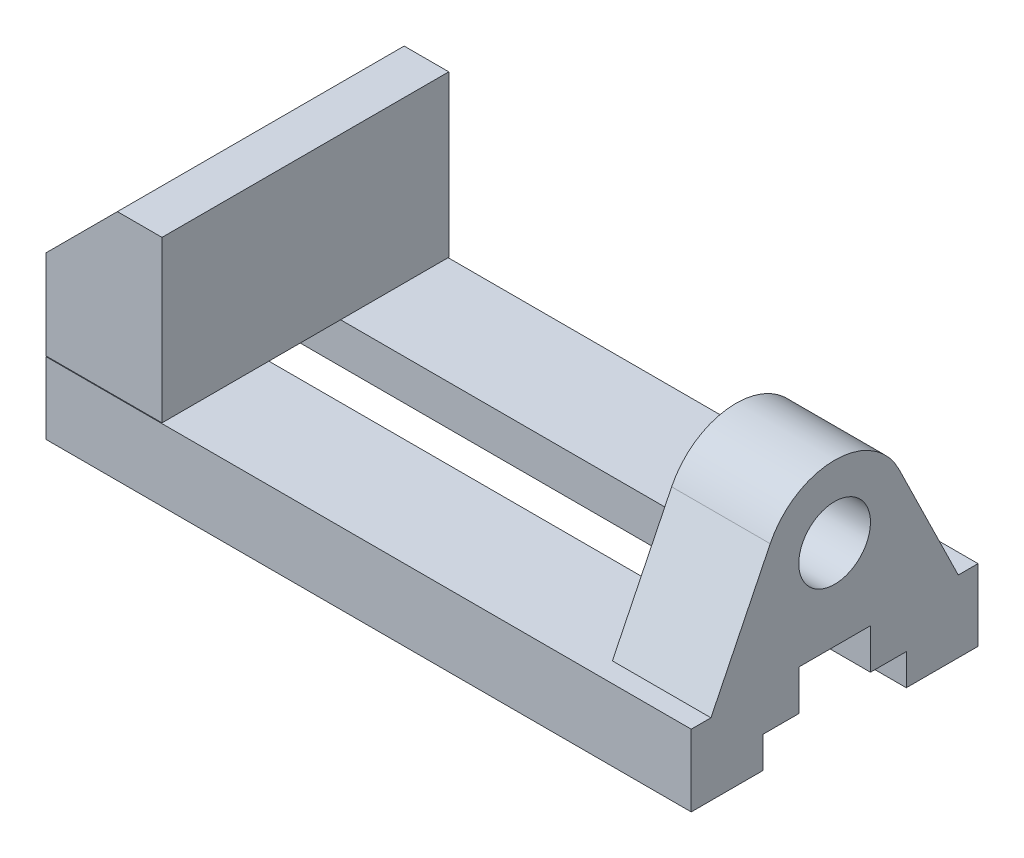
ISO-10303-21;
HEADER;
FILE_DESCRIPTION(('STEP AP214'),'2;1');
FILE_NAME('part.step','',(''),(''),'','','');
FILE_SCHEMA(('AUTOMOTIVE_DESIGN { 1 0 10303 214 1 1 1 1 }'));
ENDSEC;
DATA;
#1=APPLICATION_CONTEXT('core data for automotive mechanical design processes');
#2=APPLICATION_PROTOCOL_DEFINITION('international standard','automotive_design',2000,#1);
#3=PRODUCT_CONTEXT('',#1,'mechanical');
#4=PRODUCT('Part','Part','',(#3));
#5=PRODUCT_RELATED_PRODUCT_CATEGORY('part','',(#4));
#6=PRODUCT_DEFINITION_FORMATION('','',#4);
#7=PRODUCT_DEFINITION_CONTEXT('part definition',#1,'design');
#8=PRODUCT_DEFINITION('design','',#6,#7);
#9=PRODUCT_DEFINITION_SHAPE('','',#8);
#10=(LENGTH_UNIT() NAMED_UNIT(*) SI_UNIT(.MILLI.,.METRE.));
#11=(NAMED_UNIT(*) PLANE_ANGLE_UNIT() SI_UNIT($,.RADIAN.));
#12=(NAMED_UNIT(*) SI_UNIT($,.STERADIAN.) SOLID_ANGLE_UNIT());
#13=UNCERTAINTY_MEASURE_WITH_UNIT(LENGTH_MEASURE(1.E-05),#10,'distance_accuracy_value','');
#14=(GEOMETRIC_REPRESENTATION_CONTEXT(3) GLOBAL_UNCERTAINTY_ASSIGNED_CONTEXT((#13)) GLOBAL_UNIT_ASSIGNED_CONTEXT((#10,
#11,#12)) REPRESENTATION_CONTEXT('',''));
#15=CARTESIAN_POINT('',(0.,0.,0.));
#16=DIRECTION('',(0.,0.,1.));
#17=DIRECTION('',(1.,0.,0.));
#18=AXIS2_PLACEMENT_3D('',#15,#16,#17);
#19=CARTESIAN_POINT('',(-72.,8.15004747972741,-32.));
#20=DIRECTION('',(-1.,0.,0.));
#21=DIRECTION('',(0.,0.,1.));
#22=AXIS2_PLACEMENT_3D('',#19,#20,#21);
#23=PLANE('',#22);
#24=DIRECTION('',(0.,-1.,0.));
#25=VECTOR('',#24,1.);
#26=CARTESIAN_POINT('',(-72.,8.15004747972741,32.));
#27=LINE('',#26,#25);
#28=CARTESIAN_POINT('',(-72.,28.0666877687677,32.));
#29=VERTEX_POINT('',#28);
#30=CARTESIAN_POINT('',(-72.,8.15004747972741,32.));
#31=VERTEX_POINT('',#30);
#32=EDGE_CURVE('E128',#29,#31,#27,.T.);
#33=ORIENTED_EDGE('',*,*,#32,.F.);
#34=DIRECTION('',(0.,0.,1.));
#35=VECTOR('',#34,1.);
#36=CARTESIAN_POINT('',(-72.,28.0666877687677,-32.));
#37=LINE('',#36,#35);
#38=CARTESIAN_POINT('',(-72.,28.0666877687677,-32.));
#39=VERTEX_POINT('',#38);
#40=EDGE_CURVE('E12',#39,#29,#37,.T.);
#41=ORIENTED_EDGE('',*,*,#40,.F.);
#42=DIRECTION('',(0.,-1.,0.));
#43=VECTOR('',#42,1.);
#44=CARTESIAN_POINT('',(-72.,8.15004747972741,-32.));
#45=LINE('',#44,#43);
#46=CARTESIAN_POINT('',(-72.,8.15004747972741,-32.));
#47=VERTEX_POINT('',#46);
#48=EDGE_CURVE('E123',#39,#47,#45,.T.);
#49=ORIENTED_EDGE('',*,*,#48,.T.);
#50=DIRECTION('',(0.,0.,1.));
#51=VECTOR('',#50,1.);
#52=CARTESIAN_POINT('',(-72.,8.15004747972741,-32.));
#53=LINE('',#52,#51);
#54=EDGE_CURVE('E54',#47,#31,#53,.T.);
#55=ORIENTED_EDGE('',*,*,#54,.T.);
#56=EDGE_LOOP('',(#33,#41,#49,#55));
#57=FACE_BOUND('',#56,.T.);
#58=ADVANCED_FACE('F51',(#57),#23,.T.);
#59=CARTESIAN_POINT('',(-56.0666877687677,44.,-32.));
#60=DIRECTION('',(-0.707106781186547,0.707106781186548,0.));
#61=DIRECTION('',(-0.707106781186548,-0.707106781186547,0.));
#62=AXIS2_PLACEMENT_3D('',#59,#60,#61);
#63=PLANE('',#62);
#64=DIRECTION('',(-0.707106781186548,-0.707106781186548,0.));
#65=VECTOR('',#64,1.);
#66=CARTESIAN_POINT('',(-56.0666877687677,44.,32.));
#67=LINE('',#66,#65);
#68=CARTESIAN_POINT('',(-56.0666877687677,44.,32.));
#69=VERTEX_POINT('',#68);
#70=EDGE_CURVE('E137',#69,#29,#67,.T.);
#71=ORIENTED_EDGE('',*,*,#70,.F.);
#72=DIRECTION('',(0.,0.,1.));
#73=VECTOR('',#72,1.);
#74=CARTESIAN_POINT('',(-56.0666877687677,44.,-32.));
#75=LINE('',#74,#73);
#76=CARTESIAN_POINT('',(-56.0666877687677,44.,-32.));
#77=VERTEX_POINT('',#76);
#78=EDGE_CURVE('E60',#77,#69,#75,.T.);
#79=ORIENTED_EDGE('',*,*,#78,.F.);
#80=DIRECTION('',(-0.707106781186548,-0.707106781186548,0.));
#81=VECTOR('',#80,1.);
#82=CARTESIAN_POINT('',(-56.0666877687677,44.,-32.));
#83=LINE('',#82,#81);
#84=EDGE_CURVE('E118',#77,#39,#83,.T.);
#85=ORIENTED_EDGE('',*,*,#84,.T.);
#86=ORIENTED_EDGE('',*,*,#40,.T.);
#87=EDGE_LOOP('',(#71,#79,#85,#86));
#88=FACE_BOUND('',#87,.T.);
#89=ADVANCED_FACE('F143',(#88),#63,.T.);
#90=CARTESIAN_POINT('',(-56.0666877687677,44.,-32.));
#91=DIRECTION('',(0.,1.,0.));
#92=DIRECTION('',(0.,0.,1.));
#93=AXIS2_PLACEMENT_3D('',#90,#91,#92);
#94=PLANE('',#93);
#95=DIRECTION('',(-1.,0.,0.));
#96=VECTOR('',#95,1.);
#97=CARTESIAN_POINT('',(-56.0666877687677,44.,32.));
#98=LINE('',#97,#96);
#99=CARTESIAN_POINT('',(-46.1083676242476,44.,32.));
#100=VERTEX_POINT('',#99);
#101=EDGE_CURVE('E107',#100,#69,#98,.T.);
#102=ORIENTED_EDGE('',*,*,#101,.F.);
#103=DIRECTION('',(0.,0.,1.));
#104=VECTOR('',#103,1.);
#105=CARTESIAN_POINT('',(-46.1083676242476,44.,-32.));
#106=LINE('',#105,#104);
#107=CARTESIAN_POINT('',(-46.1083676242476,44.,-32.));
#108=VERTEX_POINT('',#107);
#109=EDGE_CURVE('E102',#108,#100,#106,.T.);
#110=ORIENTED_EDGE('',*,*,#109,.F.);
#111=DIRECTION('',(-1.,0.,0.));
#112=VECTOR('',#111,1.);
#113=CARTESIAN_POINT('',(-56.0666877687677,44.,-32.));
#114=LINE('',#113,#112);
#115=EDGE_CURVE('E105',#108,#77,#114,.T.);
#116=ORIENTED_EDGE('',*,*,#115,.T.);
#117=ORIENTED_EDGE('',*,*,#78,.T.);
#118=EDGE_LOOP('',(#102,#110,#116,#117));
#119=FACE_BOUND('',#118,.T.);
#120=ADVANCED_FACE('F104',(#119),#94,.T.);
#121=CARTESIAN_POINT('',(-46.1083676242476,8.15004747972741,-32.));
#122=DIRECTION('',(1.,0.,0.));
#123=DIRECTION('',(0.,0.,-1.));
#124=AXIS2_PLACEMENT_3D('',#121,#122,#123);
#125=PLANE('',#124);
#126=DIRECTION('',(0.,1.,0.));
#127=VECTOR('',#126,1.);
#128=CARTESIAN_POINT('',(-46.1083676242476,8.15004747972741,32.));
#129=LINE('',#128,#127);
#130=CARTESIAN_POINT('',(-46.1083676242476,8.15004747972741,32.));
#131=VERTEX_POINT('',#130);
#132=EDGE_CURVE('E134',#131,#100,#129,.T.);
#133=ORIENTED_EDGE('',*,*,#132,.F.);
#134=DIRECTION('',(0.,0.,1.));
#135=VECTOR('',#134,1.);
#136=CARTESIAN_POINT('',(-46.1083676242476,8.15004747972741,-32.));
#137=LINE('',#136,#135);
#138=CARTESIAN_POINT('',(-46.1083676242476,8.15004747972741,-32.));
#139=VERTEX_POINT('',#138);
#140=EDGE_CURVE('E112',#139,#131,#137,.T.);
#141=ORIENTED_EDGE('',*,*,#140,.F.);
#142=DIRECTION('',(0.,1.,0.));
#143=VECTOR('',#142,1.);
#144=CARTESIAN_POINT('',(-46.1083676242476,8.15004747972741,-32.));
#145=LINE('',#144,#143);
#146=EDGE_CURVE('E117',#139,#108,#145,.T.);
#147=ORIENTED_EDGE('',*,*,#146,.T.);
#148=ORIENTED_EDGE('',*,*,#109,.T.);
#149=EDGE_LOOP('',(#133,#141,#147,#148));
#150=FACE_BOUND('',#149,.T.);
#151=ADVANCED_FACE('F120',(#150),#125,.T.);
#152=CARTESIAN_POINT('',(-72.,8.15004747972741,-32.));
#153=DIRECTION('',(0.,-1.,0.));
#154=DIRECTION('',(1.,0.,0.));
#155=AXIS2_PLACEMENT_3D('',#152,#153,#154);
#156=PLANE('',#155);
#157=DIRECTION('',(1.,0.,0.));
#158=VECTOR('',#157,1.);
#159=CARTESIAN_POINT('',(-72.,8.15004747972741,32.));
#160=LINE('',#159,#158);
#161=EDGE_CURVE('E131',#31,#131,#160,.T.);
#162=ORIENTED_EDGE('',*,*,#161,.F.);
#163=ORIENTED_EDGE('',*,*,#54,.F.);
#164=DIRECTION('',(1.,0.,0.));
#165=VECTOR('',#164,1.);
#166=CARTESIAN_POINT('',(-72.,8.15004747972741,-32.));
#167=LINE('',#166,#165);
#168=EDGE_CURVE('E121',#47,#139,#167,.T.);
#169=ORIENTED_EDGE('',*,*,#168,.T.);
#170=ORIENTED_EDGE('',*,*,#140,.T.);
#171=EDGE_LOOP('',(#162,#163,#169,#170));
#172=FACE_BOUND('',#171,.T.);
#173=ADVANCED_FACE('F140',(#172),#156,.T.);
#174=CARTESIAN_POINT('',(0.,0.,-32.));
#175=DIRECTION('',(0.,0.,-1.));
#176=DIRECTION('',(-1.,0.,0.));
#177=AXIS2_PLACEMENT_3D('',#174,#175,#176);
#178=PLANE('',#177);
#179=ORIENTED_EDGE('',*,*,#48,.F.);
#180=ORIENTED_EDGE('',*,*,#84,.F.);
#181=ORIENTED_EDGE('',*,*,#115,.F.);
#182=ORIENTED_EDGE('',*,*,#146,.F.);
#183=ORIENTED_EDGE('',*,*,#168,.F.);
#184=EDGE_LOOP('',(#179,#180,#181,#182,#183));
#185=FACE_BOUND('',#184,.T.);
#186=ADVANCED_FACE('F116',(#185),#178,.T.);
#187=CARTESIAN_POINT('',(0.,0.,32.));
#188=DIRECTION('',(0.,0.,-1.));
#189=DIRECTION('',(-1.,0.,0.));
#190=AXIS2_PLACEMENT_3D('',#187,#188,#189);
#191=PLANE('',#190);
#192=ORIENTED_EDGE('',*,*,#32,.T.);
#193=ORIENTED_EDGE('',*,*,#161,.T.);
#194=ORIENTED_EDGE('',*,*,#132,.T.);
#195=ORIENTED_EDGE('',*,*,#101,.T.);
#196=ORIENTED_EDGE('',*,*,#70,.T.);
#197=EDGE_LOOP('',(#192,#193,#194,#195,#196));
#198=FACE_BOUND('',#197,.T.);
#199=ADVANCED_FACE('F142',(#198),#191,.F.);
#200=CLOSED_SHELL('',(#58,#89,#120,#151,#173,#186,#199));
#201=MANIFOLD_SOLID_BREP('B2',#200);
#202=CARTESIAN_POINT('',(-72.,7.99999999999999,32.));
#203=DIRECTION('',(1.,0.,0.));
#204=DIRECTION('',(0.,0.,-1.));
#205=AXIS2_PLACEMENT_3D('',#202,#203,#204);
#206=PLANE('',#205);
#207=DIRECTION('',(0.,0.,1.));
#208=VECTOR('',#207,1.);
#209=CARTESIAN_POINT('',(-72.,-0.999999999999851,-16.));
#210=LINE('',#209,#208);
#211=CARTESIAN_POINT('',(-72.,-0.999999999999851,-16.));
#212=VERTEX_POINT('',#211);
#213=CARTESIAN_POINT('',(-72.,-0.999999999999854,-8.00000000000001));
#214=VERTEX_POINT('',#213);
#215=EDGE_CURVE('E379',#212,#214,#210,.T.);
#216=ORIENTED_EDGE('',*,*,#215,.T.);
#217=DIRECTION('',(0.,1.,0.));
#218=VECTOR('',#217,1.);
#219=CARTESIAN_POINT('',(-72.,-0.999999999999854,-8.00000000000001));
#220=LINE('',#219,#218);
#221=CARTESIAN_POINT('',(-72.,8.00000000000014,-8.));
#222=VERTEX_POINT('',#221);
#223=EDGE_CURVE('E382',#214,#222,#220,.T.);
#224=ORIENTED_EDGE('',*,*,#223,.T.);
#225=DIRECTION('',(0.,0.,-1.));
#226=VECTOR('',#225,1.);
#227=CARTESIAN_POINT('',(-72.,7.99999999999999,32.));
#228=LINE('',#227,#226);
#229=CARTESIAN_POINT('',(-72.,7.99999999999999,-32.));
#230=VERTEX_POINT('',#229);
#231=EDGE_CURVE('E468',#222,#230,#228,.T.);
#232=ORIENTED_EDGE('',*,*,#231,.T.);
#233=DIRECTION('',(0.,-1.,0.));
#234=VECTOR('',#233,1.);
#235=CARTESIAN_POINT('',(-72.,7.99999999999999,-32.));
#236=LINE('',#235,#234);
#237=CARTESIAN_POINT('',(-72.,-8.00000000000001,-32.));
#238=VERTEX_POINT('',#237);
#239=EDGE_CURVE('E456',#230,#238,#236,.T.);
#240=ORIENTED_EDGE('',*,*,#239,.T.);
#241=DIRECTION('',(0.,0.,-1.));
#242=VECTOR('',#241,1.);
#243=CARTESIAN_POINT('',(-72.,-8.00000000000001,32.));
#244=LINE('',#243,#242);
#245=CARTESIAN_POINT('',(-72.,-7.99999999999986,-16.));
#246=VERTEX_POINT('',#245);
#247=EDGE_CURVE('E210',#246,#238,#244,.T.);
#248=ORIENTED_EDGE('',*,*,#247,.F.);
#249=DIRECTION('',(0.,1.,0.));
#250=VECTOR('',#249,1.);
#251=CARTESIAN_POINT('',(-72.,-7.99999999999986,-16.));
#252=LINE('',#251,#250);
#253=EDGE_CURVE('E376',#246,#212,#252,.T.);
#254=ORIENTED_EDGE('',*,*,#253,.T.);
#255=EDGE_LOOP('',(#216,#224,#232,#240,#248,#254));
#256=FACE_BOUND('',#255,.T.);
#257=ADVANCED_FACE('F202',(#256),#206,.F.);
#258=CARTESIAN_POINT('',(72.,-7.99999999999999,32.));
#259=DIRECTION('',(0.,1.,0.));
#260=DIRECTION('',(-1.,0.,0.));
#261=AXIS2_PLACEMENT_3D('',#258,#259,#260);
#262=PLANE('',#261);
#263=CARTESIAN_POINT('',(-36.,-8.00000000000001,-22.));
#264=DIRECTION('',(0.,-1.,0.));
#265=DIRECTION('',(-1.,0.,0.));
#266=AXIS2_PLACEMENT_3D('',#263,#264,#265);
#267=CIRCLE('',#266,3.34999999999999);
#268=CARTESIAN_POINT('',(-39.35,-8.00000000000001,-22.));
#269=VERTEX_POINT('',#268);
#270=EDGE_CURVE('E342',#269,#269,#267,.T.);
#271=ORIENTED_EDGE('',*,*,#270,.F.);
#272=EDGE_LOOP('',(#271));
#273=FACE_BOUND('',#272,.T.);
#274=CARTESIAN_POINT('',(34.,-8.,-22.));
#275=DIRECTION('',(0.,-1.,0.));
#276=DIRECTION('',(0.,0.,-1.));
#277=AXIS2_PLACEMENT_3D('',#274,#275,#276);
#278=CIRCLE('',#277,3.35);
#279=CARTESIAN_POINT('',(34.,-8.,-25.35));
#280=VERTEX_POINT('',#279);
#281=EDGE_CURVE('E350',#280,#280,#278,.T.);
#282=ORIENTED_EDGE('',*,*,#281,.F.);
#283=EDGE_LOOP('',(#282));
#284=FACE_BOUND('',#283,.T.);
#285=DIRECTION('',(0.,0.,-1.));
#286=VECTOR('',#285,1.);
#287=CARTESIAN_POINT('',(72.,-7.99999999999999,32.));
#288=LINE('',#287,#286);
#289=CARTESIAN_POINT('',(72.,-7.99999999999998,-16.));
#290=VERTEX_POINT('',#289);
#291=CARTESIAN_POINT('',(72.,-7.99999999999999,-32.));
#292=VERTEX_POINT('',#291);
#293=EDGE_CURVE('E484',#290,#292,#288,.T.);
#294=ORIENTED_EDGE('',*,*,#293,.F.);
#295=DIRECTION('',(1.,0.,0.));
#296=VECTOR('',#295,1.);
#297=CARTESIAN_POINT('',(-72.,-7.99999999999986,-16.));
#298=LINE('',#297,#296);
#299=EDGE_CURVE('E414',#246,#290,#298,.T.);
#300=ORIENTED_EDGE('',*,*,#299,.F.);
#301=ORIENTED_EDGE('',*,*,#247,.T.);
#302=DIRECTION('',(1.,0.,0.));
#303=VECTOR('',#302,1.);
#304=CARTESIAN_POINT('',(72.,-7.99999999999999,-32.));
#305=LINE('',#304,#303);
#306=EDGE_CURVE('E471',#238,#292,#305,.T.);
#307=ORIENTED_EDGE('',*,*,#306,.T.);
#308=EDGE_LOOP('',(#294,#300,#301,#307));
#309=FACE_BOUND('',#308,.T.);
#310=ADVANCED_FACE('F501',(#273,#284,#309),#262,.F.);
#311=CARTESIAN_POINT('',(72.,8.00000000000001,32.));
#312=DIRECTION('',(0.,-1.,0.));
#313=DIRECTION('',(1.,0.,0.));
#314=AXIS2_PLACEMENT_3D('',#311,#312,#313);
#315=PLANE('',#314);
#316=DIRECTION('',(0.,0.,1.));
#317=VECTOR('',#316,1.);
#318=CARTESIAN_POINT('',(50.,8.00000000000001,32.));
#319=LINE('',#318,#317);
#320=CARTESIAN_POINT('',(50.,8.00000000000001,8.));
#321=VERTEX_POINT('',#320);
#322=CARTESIAN_POINT('',(50.,8.00000000000001,27.5968842437562));
#323=VERTEX_POINT('',#322);
#324=EDGE_CURVE('E448',#321,#323,#319,.T.);
#325=ORIENTED_EDGE('',*,*,#324,.F.);
#326=DIRECTION('',(1.,0.,0.));
#327=VECTOR('',#326,1.);
#328=CARTESIAN_POINT('',(-72.,8.00000000000014,8.));
#329=LINE('',#328,#327);
#330=CARTESIAN_POINT('',(-72.,8.00000000000014,8.));
#331=VERTEX_POINT('',#330);
#332=EDGE_CURVE('E217',#331,#321,#329,.T.);
#333=ORIENTED_EDGE('',*,*,#332,.F.);
#334=CARTESIAN_POINT('',(-72.,7.99999999999999,32.));
#335=VERTEX_POINT('',#334);
#336=EDGE_CURVE('E479',#335,#331,#228,.T.);
#337=ORIENTED_EDGE('',*,*,#336,.F.);
#338=DIRECTION('',(-1.,0.,0.));
#339=VECTOR('',#338,1.);
#340=CARTESIAN_POINT('',(72.,8.00000000000001,32.));
#341=LINE('',#340,#339);
#342=CARTESIAN_POINT('',(72.,8.00000000000001,32.));
#343=VERTEX_POINT('',#342);
#344=EDGE_CURVE('E466',#343,#335,#341,.T.);
#345=ORIENTED_EDGE('',*,*,#344,.F.);
#346=DIRECTION('',(0.,0.,-1.));
#347=VECTOR('',#346,1.);
#348=CARTESIAN_POINT('',(72.,8.00000000000001,32.));
#349=LINE('',#348,#347);
#350=CARTESIAN_POINT('',(72.,8.00000000000001,27.5968842437562));
#351=VERTEX_POINT('',#350);
#352=EDGE_CURVE('E483',#343,#351,#349,.T.);
#353=ORIENTED_EDGE('',*,*,#352,.T.);
#354=DIRECTION('',(1.,0.,0.));
#355=VECTOR('',#354,1.);
#356=CARTESIAN_POINT('',(50.,8.00000000000003,27.5968842437562));
#357=LINE('',#356,#355);
#358=EDGE_CURVE('E438',#323,#351,#357,.T.);
#359=ORIENTED_EDGE('',*,*,#358,.F.);
#360=EDGE_LOOP('',(#325,#333,#337,#345,#353,#359));
#361=FACE_BOUND('',#360,.T.);
#362=ADVANCED_FACE('F524',(#361),#315,.F.);
#363=ORIENTED_EDGE('',*,*,#336,.T.);
#364=DIRECTION('',(0.,-1.,0.));
#365=VECTOR('',#364,1.);
#366=CARTESIAN_POINT('',(-72.,-0.999999999999868,8.));
#367=LINE('',#366,#365);
#368=CARTESIAN_POINT('',(-72.,-0.999999999999868,8.));
#369=VERTEX_POINT('',#368);
#370=EDGE_CURVE('E366',#331,#369,#367,.T.);
#371=ORIENTED_EDGE('',*,*,#370,.T.);
#372=DIRECTION('',(0.,0.,1.));
#373=VECTOR('',#372,1.);
#374=CARTESIAN_POINT('',(-72.,-0.999999999999868,16.));
#375=LINE('',#374,#373);
#376=CARTESIAN_POINT('',(-72.,-0.999999999999868,16.));
#377=VERTEX_POINT('',#376);
#378=EDGE_CURVE('E369',#369,#377,#375,.T.);
#379=ORIENTED_EDGE('',*,*,#378,.T.);
#380=DIRECTION('',(0.,-1.,0.));
#381=VECTOR('',#380,1.);
#382=CARTESIAN_POINT('',(-72.,-7.99999999999987,16.));
#383=LINE('',#382,#381);
#384=CARTESIAN_POINT('',(-72.,-7.99999999999987,16.));
#385=VERTEX_POINT('',#384);
#386=EDGE_CURVE('E373',#377,#385,#383,.T.);
#387=ORIENTED_EDGE('',*,*,#386,.T.);
#388=CARTESIAN_POINT('',(-72.,-8.00000000000001,32.));
#389=VERTEX_POINT('',#388);
#390=EDGE_CURVE('E49',#389,#385,#244,.T.);
#391=ORIENTED_EDGE('',*,*,#390,.F.);
#392=DIRECTION('',(0.,-1.,0.));
#393=VECTOR('',#392,1.);
#394=CARTESIAN_POINT('',(-72.,7.99999999999999,32.));
#395=LINE('',#394,#393);
#396=EDGE_CURVE('E458',#335,#389,#395,.T.);
#397=ORIENTED_EDGE('',*,*,#396,.F.);
#398=EDGE_LOOP('',(#363,#371,#379,#387,#391,#397));
#399=FACE_BOUND('',#398,.T.);
#400=ADVANCED_FACE('F204',(#399),#206,.F.);
#401=CARTESIAN_POINT('',(-36.,-8.00000000000001,22.));
#402=DIRECTION('',(0.,1.,0.));
#403=DIRECTION('',(-1.,0.,0.));
#404=AXIS2_PLACEMENT_3D('',#401,#402,#403);
#405=CIRCLE('',#404,3.34999999999999);
#406=CARTESIAN_POINT('',(-39.35,-8.00000000000001,22.));
#407=VERTEX_POINT('',#406);
#408=EDGE_CURVE('E356',#407,#407,#405,.T.);
#409=ORIENTED_EDGE('',*,*,#408,.T.);
#410=EDGE_LOOP('',(#409));
#411=FACE_BOUND('',#410,.T.);
#412=CARTESIAN_POINT('',(34.,-8.,22.));
#413=DIRECTION('',(0.,1.,0.));
#414=DIRECTION('',(0.,0.,1.));
#415=AXIS2_PLACEMENT_3D('',#412,#413,#414);
#416=CIRCLE('',#415,3.35);
#417=CARTESIAN_POINT('',(34.,-8.,25.35));
#418=VERTEX_POINT('',#417);
#419=EDGE_CURVE('E362',#418,#418,#416,.T.);
#420=ORIENTED_EDGE('',*,*,#419,.T.);
#421=EDGE_LOOP('',(#420));
#422=FACE_BOUND('',#421,.T.);
#423=ORIENTED_EDGE('',*,*,#390,.T.);
#424=DIRECTION('',(1.,0.,0.));
#425=VECTOR('',#424,1.);
#426=CARTESIAN_POINT('',(-72.,-7.99999999999987,16.));
#427=LINE('',#426,#425);
#428=CARTESIAN_POINT('',(72.,-7.99999999999999,16.));
#429=VERTEX_POINT('',#428);
#430=EDGE_CURVE('E416',#385,#429,#427,.T.);
#431=ORIENTED_EDGE('',*,*,#430,.T.);
#432=CARTESIAN_POINT('',(72.,-7.99999999999999,32.));
#433=VERTEX_POINT('',#432);
#434=EDGE_CURVE('E485',#433,#429,#288,.T.);
#435=ORIENTED_EDGE('',*,*,#434,.F.);
#436=DIRECTION('',(1.,0.,0.));
#437=VECTOR('',#436,1.);
#438=CARTESIAN_POINT('',(72.,-7.99999999999999,32.));
#439=LINE('',#438,#437);
#440=EDGE_CURVE('E461',#389,#433,#439,.T.);
#441=ORIENTED_EDGE('',*,*,#440,.F.);
#442=EDGE_LOOP('',(#423,#431,#435,#441));
#443=FACE_BOUND('',#442,.T.);
#444=ADVANCED_FACE('F530',(#411,#422,#443),#262,.F.);
#445=CARTESIAN_POINT('',(72.,8.00000000000001,32.));
#446=DIRECTION('',(-1.,0.,0.));
#447=DIRECTION('',(0.,-1.,0.));
#448=AXIS2_PLACEMENT_3D('',#445,#446,#447);
#449=PLANE('',#448);
#450=DIRECTION('',(0.,0.,1.));
#451=VECTOR('',#450,1.);
#452=CARTESIAN_POINT('',(72.,-0.999999999999976,-16.));
#453=LINE('',#452,#451);
#454=CARTESIAN_POINT('',(72.,-0.999999999999976,-16.));
#455=VERTEX_POINT('',#454);
#456=CARTESIAN_POINT('',(72.,-0.999999999999979,-8.00000000000001));
#457=VERTEX_POINT('',#456);
#458=EDGE_CURVE('E396',#455,#457,#453,.T.);
#459=ORIENTED_EDGE('',*,*,#458,.F.);
#460=DIRECTION('',(0.,1.,0.));
#461=VECTOR('',#460,1.);
#462=CARTESIAN_POINT('',(72.,-7.99999999999998,-16.));
#463=LINE('',#462,#461);
#464=EDGE_CURVE('E393',#290,#455,#463,.T.);
#465=ORIENTED_EDGE('',*,*,#464,.F.);
#466=ORIENTED_EDGE('',*,*,#293,.T.);
#467=DIRECTION('',(0.,1.,0.));
#468=VECTOR('',#467,1.);
#469=CARTESIAN_POINT('',(72.,8.00000000000001,-32.));
#470=LINE('',#469,#468);
#471=CARTESIAN_POINT('',(72.,8.00000000000001,-32.));
#472=VERTEX_POINT('',#471);
#473=EDGE_CURVE('E474',#292,#472,#470,.T.);
#474=ORIENTED_EDGE('',*,*,#473,.T.);
#475=CARTESIAN_POINT('',(72.,8.00000000000001,-27.5968842437562));
#476=VERTEX_POINT('',#475);
#477=EDGE_CURVE('E482',#476,#472,#349,.T.);
#478=ORIENTED_EDGE('',*,*,#477,.F.);
#479=DIRECTION('',(0.,0.89826162196657,0.439461100101006));
#480=VECTOR('',#479,1.);
#481=CARTESIAN_POINT('',(72.,8.00000000000001,-27.5968842437562));
#482=LINE('',#481,#480);
#483=CARTESIAN_POINT('',(72.,35.0313776016161,-14.3721859514651));
#484=VERTEX_POINT('',#483);
#485=EDGE_CURVE('E441',#476,#484,#482,.T.);
#486=ORIENTED_EDGE('',*,*,#485,.T.);
#487=CARTESIAN_POINT('',(72.,28.,0.));
#488=DIRECTION('',(1.,0.,0.));
#489=DIRECTION('',(0.,1.,0.));
#490=AXIS2_PLACEMENT_3D('',#487,#488,#489);
#491=CIRCLE('',#490,16.);
#492=CARTESIAN_POINT('',(72.,35.0313776016161,14.3721859514651));
#493=VERTEX_POINT('',#492);
#494=EDGE_CURVE('E432',#484,#493,#491,.T.);
#495=ORIENTED_EDGE('',*,*,#494,.T.);
#496=DIRECTION('',(0.,-0.89826162196657,0.439461100101006));
#497=VECTOR('',#496,1.);
#498=CARTESIAN_POINT('',(72.,8.00000000000001,27.5968842437562));
#499=LINE('',#498,#497);
#500=EDGE_CURVE('E425',#493,#351,#499,.T.);
#501=ORIENTED_EDGE('',*,*,#500,.T.);
#502=ORIENTED_EDGE('',*,*,#352,.F.);
#503=DIRECTION('',(0.,1.,0.));
#504=VECTOR('',#503,1.);
#505=CARTESIAN_POINT('',(72.,8.00000000000001,32.));
#506=LINE('',#505,#504);
#507=EDGE_CURVE('E464',#433,#343,#506,.T.);
#508=ORIENTED_EDGE('',*,*,#507,.F.);
#509=ORIENTED_EDGE('',*,*,#434,.T.);
#510=DIRECTION('',(0.,-1.,0.));
#511=VECTOR('',#510,1.);
#512=CARTESIAN_POINT('',(72.,-7.99999999999999,16.));
#513=LINE('',#512,#511);
#514=CARTESIAN_POINT('',(72.,-0.999999999999993,16.));
#515=VERTEX_POINT('',#514);
#516=EDGE_CURVE('E391',#515,#429,#513,.T.);
#517=ORIENTED_EDGE('',*,*,#516,.F.);
#518=DIRECTION('',(0.,0.,1.));
#519=VECTOR('',#518,1.);
#520=CARTESIAN_POINT('',(72.,-0.999999999999993,16.));
#521=LINE('',#520,#519);
#522=CARTESIAN_POINT('',(72.,-0.999999999999993,8.));
#523=VERTEX_POINT('',#522);
#524=EDGE_CURVE('E388',#523,#515,#521,.T.);
#525=ORIENTED_EDGE('',*,*,#524,.F.);
#526=DIRECTION('',(0.,-1.,0.));
#527=VECTOR('',#526,1.);
#528=CARTESIAN_POINT('',(72.,-0.999999999999993,8.));
#529=LINE('',#528,#527);
#530=CARTESIAN_POINT('',(72.,8.00000000000001,8.));
#531=VERTEX_POINT('',#530);
#532=EDGE_CURVE('E365',#531,#523,#529,.T.);
#533=ORIENTED_EDGE('',*,*,#532,.F.);
#534=DIRECTION('',(0.,0.,1.));
#535=VECTOR('',#534,1.);
#536=CARTESIAN_POINT('',(72.,8.00000000000002,-8.));
#537=LINE('',#536,#535);
#538=CARTESIAN_POINT('',(72.,8.00000000000002,-8.));
#539=VERTEX_POINT('',#538);
#540=EDGE_CURVE('E370',#539,#531,#537,.T.);
#541=ORIENTED_EDGE('',*,*,#540,.F.);
#542=DIRECTION('',(0.,1.,0.));
#543=VECTOR('',#542,1.);
#544=CARTESIAN_POINT('',(72.,-0.999999999999979,-8.00000000000001));
#545=LINE('',#544,#543);
#546=EDGE_CURVE('E399',#457,#539,#545,.T.);
#547=ORIENTED_EDGE('',*,*,#546,.F.);
#548=EDGE_LOOP('',(#459,#465,#466,#474,#478,#486,#495,#501,#502,#508,#509,#517,#525,#533,#541,#547));
#549=FACE_BOUND('',#548,.T.);
#550=CARTESIAN_POINT('',(72.,28.,0.));
#551=DIRECTION('',(1.,0.,0.));
#552=DIRECTION('',(0.,1.,0.));
#553=AXIS2_PLACEMENT_3D('',#550,#551,#552);
#554=CIRCLE('',#553,8.);
#555=CARTESIAN_POINT('',(72.,36.,0.));
#556=VERTEX_POINT('',#555);
#557=EDGE_CURVE('E405',#556,#556,#554,.T.);
#558=ORIENTED_EDGE('',*,*,#557,.F.);
#559=EDGE_LOOP('',(#558));
#560=FACE_BOUND('',#559,.T.);
#561=ADVANCED_FACE('F494',(#549,#560),#449,.F.);
#562=ORIENTED_EDGE('',*,*,#231,.F.);
#563=DIRECTION('',(1.,0.,0.));
#564=VECTOR('',#563,1.);
#565=CARTESIAN_POINT('',(-72.,8.00000000000014,-8.));
#566=LINE('',#565,#564);
#567=CARTESIAN_POINT('',(50.,8.00000000000004,-8.));
#568=VERTEX_POINT('',#567);
#569=EDGE_CURVE('E407',#222,#568,#566,.T.);
#570=ORIENTED_EDGE('',*,*,#569,.T.);
#571=CARTESIAN_POINT('',(50.,8.00000000000001,-27.5968842437562));
#572=VERTEX_POINT('',#571);
#573=EDGE_CURVE('E225',#572,#568,#319,.T.);
#574=ORIENTED_EDGE('',*,*,#573,.F.);
#575=DIRECTION('',(1.,0.,0.));
#576=VECTOR('',#575,1.);
#577=CARTESIAN_POINT('',(50.,8.00000000000003,-27.5968842437562));
#578=LINE('',#577,#576);
#579=EDGE_CURVE('E451',#572,#476,#578,.T.);
#580=ORIENTED_EDGE('',*,*,#579,.T.);
#581=ORIENTED_EDGE('',*,*,#477,.T.);
#582=DIRECTION('',(-1.,0.,0.));
#583=VECTOR('',#582,1.);
#584=CARTESIAN_POINT('',(72.,8.00000000000001,-32.));
#585=LINE('',#584,#583);
#586=EDGE_CURVE('E462',#472,#230,#585,.T.);
#587=ORIENTED_EDGE('',*,*,#586,.T.);
#588=EDGE_LOOP('',(#562,#570,#574,#580,#581,#587));
#589=FACE_BOUND('',#588,.T.);
#590=ADVANCED_FACE('F507',(#589),#315,.F.);
#591=CARTESIAN_POINT('',(0.,0.,32.));
#592=DIRECTION('',(0.,0.,-1.));
#593=DIRECTION('',(-1.,0.,0.));
#594=AXIS2_PLACEMENT_3D('',#591,#592,#593);
#595=PLANE('',#594);
#596=ORIENTED_EDGE('',*,*,#344,.T.);
#597=ORIENTED_EDGE('',*,*,#396,.T.);
#598=ORIENTED_EDGE('',*,*,#440,.T.);
#599=ORIENTED_EDGE('',*,*,#507,.T.);
#600=EDGE_LOOP('',(#596,#597,#598,#599));
#601=FACE_BOUND('',#600,.T.);
#602=ADVANCED_FACE('F527',(#601),#595,.F.);
#603=CARTESIAN_POINT('',(0.,0.,-32.));
#604=DIRECTION('',(0.,0.,-1.));
#605=DIRECTION('',(-1.,0.,0.));
#606=AXIS2_PLACEMENT_3D('',#603,#604,#605);
#607=PLANE('',#606);
#608=ORIENTED_EDGE('',*,*,#473,.F.);
#609=ORIENTED_EDGE('',*,*,#306,.F.);
#610=ORIENTED_EDGE('',*,*,#239,.F.);
#611=ORIENTED_EDGE('',*,*,#586,.F.);
#612=EDGE_LOOP('',(#608,#609,#610,#611));
#613=FACE_BOUND('',#612,.T.);
#614=ADVANCED_FACE('F505',(#613),#607,.T.);
#615=CARTESIAN_POINT('',(50.,28.,0.));
#616=DIRECTION('',(1.,0.,0.));
#617=DIRECTION('',(0.,1.,0.));
#618=AXIS2_PLACEMENT_3D('',#615,#616,#617);
#619=PLANE('',#618);
#620=CARTESIAN_POINT('',(50.,28.,0.));
#621=DIRECTION('',(1.,0.,0.));
#622=DIRECTION('',(0.,1.,0.));
#623=AXIS2_PLACEMENT_3D('',#620,#621,#622);
#624=CIRCLE('',#623,8.);
#625=CARTESIAN_POINT('',(50.,36.,0.));
#626=VERTEX_POINT('',#625);
#627=EDGE_CURVE('E422',#626,#626,#624,.T.);
#628=ORIENTED_EDGE('',*,*,#627,.T.);
#629=EDGE_LOOP('',(#628));
#630=FACE_BOUND('',#629,.T.);
#631=DIRECTION('',(0.,0.89826162196657,0.439461100101006));
#632=VECTOR('',#631,1.);
#633=CARTESIAN_POINT('',(50.,8.00000000000003,-27.5968842437562));
#634=LINE('',#633,#632);
#635=CARTESIAN_POINT('',(50.,35.0313776016161,-14.3721859514651));
#636=VERTEX_POINT('',#635);
#637=EDGE_CURVE('E431',#572,#636,#634,.T.);
#638=ORIENTED_EDGE('',*,*,#637,.F.);
#639=ORIENTED_EDGE('',*,*,#573,.T.);
#640=EDGE_CURVE('E457',#568,#321,#319,.T.);
#641=ORIENTED_EDGE('',*,*,#640,.T.);
#642=ORIENTED_EDGE('',*,*,#324,.T.);
#643=DIRECTION('',(0.,-0.89826162196657,0.439461100101006));
#644=VECTOR('',#643,1.);
#645=CARTESIAN_POINT('',(50.,8.00000000000003,27.5968842437562));
#646=LINE('',#645,#644);
#647=CARTESIAN_POINT('',(50.,35.0313776016161,14.3721859514651));
#648=VERTEX_POINT('',#647);
#649=EDGE_CURVE('E428',#648,#323,#646,.T.);
#650=ORIENTED_EDGE('',*,*,#649,.F.);
#651=CARTESIAN_POINT('',(50.,28.,0.));
#652=DIRECTION('',(1.,0.,0.));
#653=DIRECTION('',(0.,1.,0.));
#654=AXIS2_PLACEMENT_3D('',#651,#652,#653);
#655=CIRCLE('',#654,16.);
#656=EDGE_CURVE('E435',#636,#648,#655,.T.);
#657=ORIENTED_EDGE('',*,*,#656,.F.);
#658=EDGE_LOOP('',(#638,#639,#641,#642,#650,#657));
#659=FACE_BOUND('',#658,.T.);
#660=ADVANCED_FACE('F558',(#630,#659),#619,.F.);
#661=CARTESIAN_POINT('',(50.,8.00000000000003,27.5968842437562));
#662=DIRECTION('',(0.,0.439461100101006,0.89826162196657));
#663=DIRECTION('',(0.,-0.89826162196657,0.439461100101006));
#664=AXIS2_PLACEMENT_3D('',#661,#662,#663);
#665=PLANE('',#664);
#666=ORIENTED_EDGE('',*,*,#500,.F.);
#667=DIRECTION('',(1.,0.,0.));
#668=VECTOR('',#667,1.);
#669=CARTESIAN_POINT('',(50.,35.0313776016161,14.3721859514651));
#670=LINE('',#669,#668);
#671=EDGE_CURVE('E446',#648,#493,#670,.T.);
#672=ORIENTED_EDGE('',*,*,#671,.F.);
#673=ORIENTED_EDGE('',*,*,#649,.T.);
#674=ORIENTED_EDGE('',*,*,#358,.T.);
#675=EDGE_LOOP('',(#666,#672,#673,#674));
#676=FACE_BOUND('',#675,.T.);
#677=ADVANCED_FACE('F517',(#676),#665,.T.);
#678=CARTESIAN_POINT('',(50.,28.,0.));
#679=DIRECTION('',(1.,0.,0.));
#680=DIRECTION('',(0.,1.,0.));
#681=AXIS2_PLACEMENT_3D('',#678,#679,#680);
#682=CYLINDRICAL_SURFACE('',#681,16.);
#683=ORIENTED_EDGE('',*,*,#494,.F.);
#684=DIRECTION('',(1.,0.,0.));
#685=VECTOR('',#684,1.);
#686=CARTESIAN_POINT('',(50.,35.0313776016161,-14.3721859514651));
#687=LINE('',#686,#685);
#688=EDGE_CURVE('E449',#636,#484,#687,.T.);
#689=ORIENTED_EDGE('',*,*,#688,.F.);
#690=ORIENTED_EDGE('',*,*,#656,.T.);
#691=ORIENTED_EDGE('',*,*,#671,.T.);
#692=EDGE_LOOP('',(#683,#689,#690,#691));
#693=FACE_BOUND('',#692,.T.);
#694=ADVANCED_FACE('F512',(#693),#682,.T.);
#695=CARTESIAN_POINT('',(50.,8.00000000000003,-27.5968842437562));
#696=DIRECTION('',(0.,0.439461100101006,-0.89826162196657));
#697=DIRECTION('',(0.,0.89826162196657,0.439461100101006));
#698=AXIS2_PLACEMENT_3D('',#695,#696,#697);
#699=PLANE('',#698);
#700=ORIENTED_EDGE('',*,*,#485,.F.);
#701=ORIENTED_EDGE('',*,*,#579,.F.);
#702=ORIENTED_EDGE('',*,*,#637,.T.);
#703=ORIENTED_EDGE('',*,*,#688,.T.);
#704=EDGE_LOOP('',(#700,#701,#702,#703));
#705=FACE_BOUND('',#704,.T.);
#706=ADVANCED_FACE('F559',(#705),#699,.T.);
#707=CARTESIAN_POINT('',(50.,28.,0.));
#708=DIRECTION('',(1.,0.,0.));
#709=DIRECTION('',(0.,1.,0.));
#710=AXIS2_PLACEMENT_3D('',#707,#708,#709);
#711=CYLINDRICAL_SURFACE('',#710,8.);
#712=ORIENTED_EDGE('',*,*,#627,.F.);
#713=EDGE_LOOP('',(#712));
#714=FACE_BOUND('',#713,.T.);
#715=ORIENTED_EDGE('',*,*,#557,.T.);
#716=EDGE_LOOP('',(#715));
#717=FACE_BOUND('',#716,.T.);
#718=ADVANCED_FACE('F561',(#714,#717),#711,.F.);
#719=CARTESIAN_POINT('',(-72.,8.00000000000014,-8.));
#720=DIRECTION('',(0.,1.,0.));
#721=DIRECTION('',(-1.,0.,0.));
#722=AXIS2_PLACEMENT_3D('',#719,#720,#721);
#723=PLANE('',#722);
#724=EDGE_CURVE('E409',#568,#539,#566,.T.);
#725=ORIENTED_EDGE('',*,*,#724,.T.);
#726=ORIENTED_EDGE('',*,*,#540,.T.);
#727=EDGE_CURVE('E406',#321,#531,#329,.T.);
#728=ORIENTED_EDGE('',*,*,#727,.F.);
#729=ORIENTED_EDGE('',*,*,#640,.F.);
#730=EDGE_LOOP('',(#725,#726,#728,#729));
#731=FACE_BOUND('',#730,.T.);
#732=ADVANCED_FACE('F544',(#731),#723,.F.);
#733=CARTESIAN_POINT('',(-72.,-0.999999999999868,8.));
#734=DIRECTION('',(0.,0.,1.));
#735=DIRECTION('',(1.,0.,0.));
#736=AXIS2_PLACEMENT_3D('',#733,#734,#735);
#737=PLANE('',#736);
#738=ORIENTED_EDGE('',*,*,#532,.T.);
#739=DIRECTION('',(1.,0.,0.));
#740=VECTOR('',#739,1.);
#741=CARTESIAN_POINT('',(-72.,-0.999999999999868,8.));
#742=LINE('',#741,#740);
#743=EDGE_CURVE('E385',#369,#523,#742,.T.);
#744=ORIENTED_EDGE('',*,*,#743,.F.);
#745=ORIENTED_EDGE('',*,*,#370,.F.);
#746=ORIENTED_EDGE('',*,*,#332,.T.);
#747=ORIENTED_EDGE('',*,*,#727,.T.);
#748=EDGE_LOOP('',(#738,#744,#745,#746,#747));
#749=FACE_BOUND('',#748,.T.);
#750=ADVANCED_FACE('F542',(#749),#737,.F.);
#751=CARTESIAN_POINT('',(-72.,-0.999999999999854,-8.00000000000001));
#752=DIRECTION('',(0.,0.,-1.));
#753=DIRECTION('',(0.,1.,0.));
#754=AXIS2_PLACEMENT_3D('',#751,#752,#753);
#755=PLANE('',#754);
#756=ORIENTED_EDGE('',*,*,#546,.T.);
#757=ORIENTED_EDGE('',*,*,#724,.F.);
#758=ORIENTED_EDGE('',*,*,#569,.F.);
#759=ORIENTED_EDGE('',*,*,#223,.F.);
#760=DIRECTION('',(1.,0.,0.));
#761=VECTOR('',#760,1.);
#762=CARTESIAN_POINT('',(-72.,-0.999999999999854,-8.00000000000001));
#763=LINE('',#762,#761);
#764=EDGE_CURVE('E410',#214,#457,#763,.T.);
#765=ORIENTED_EDGE('',*,*,#764,.T.);
#766=EDGE_LOOP('',(#756,#757,#758,#759,#765));
#767=FACE_BOUND('',#766,.T.);
#768=ADVANCED_FACE('F548',(#767),#755,.F.);
#769=CARTESIAN_POINT('',(-72.,-0.999999999999851,-16.));
#770=DIRECTION('',(0.,1.,0.));
#771=DIRECTION('',(-1.,0.,0.));
#772=AXIS2_PLACEMENT_3D('',#769,#770,#771);
#773=PLANE('',#772);
#774=ORIENTED_EDGE('',*,*,#458,.T.);
#775=ORIENTED_EDGE('',*,*,#764,.F.);
#776=ORIENTED_EDGE('',*,*,#215,.F.);
#777=DIRECTION('',(1.,0.,0.));
#778=VECTOR('',#777,1.);
#779=CARTESIAN_POINT('',(-72.,-0.999999999999851,-16.));
#780=LINE('',#779,#778);
#781=EDGE_CURVE('E412',#212,#455,#780,.T.);
#782=ORIENTED_EDGE('',*,*,#781,.T.);
#783=EDGE_LOOP('',(#774,#775,#776,#782));
#784=FACE_BOUND('',#783,.T.);
#785=ADVANCED_FACE('F551',(#784),#773,.F.);
#786=CARTESIAN_POINT('',(-72.,-7.99999999999986,-16.));
#787=DIRECTION('',(0.,0.,-1.));
#788=DIRECTION('',(0.,1.,0.));
#789=AXIS2_PLACEMENT_3D('',#786,#787,#788);
#790=PLANE('',#789);
#791=ORIENTED_EDGE('',*,*,#464,.T.);
#792=ORIENTED_EDGE('',*,*,#781,.F.);
#793=ORIENTED_EDGE('',*,*,#253,.F.);
#794=ORIENTED_EDGE('',*,*,#299,.T.);
#795=EDGE_LOOP('',(#791,#792,#793,#794));
#796=FACE_BOUND('',#795,.T.);
#797=ADVANCED_FACE('F554',(#796),#790,.F.);
#798=CARTESIAN_POINT('',(-72.,-7.99999999999987,16.));
#799=DIRECTION('',(0.,0.,1.));
#800=DIRECTION('',(1.,0.,0.));
#801=AXIS2_PLACEMENT_3D('',#798,#799,#800);
#802=PLANE('',#801);
#803=ORIENTED_EDGE('',*,*,#516,.T.);
#804=ORIENTED_EDGE('',*,*,#430,.F.);
#805=ORIENTED_EDGE('',*,*,#386,.F.);
#806=DIRECTION('',(1.,0.,0.));
#807=VECTOR('',#806,1.);
#808=CARTESIAN_POINT('',(-72.,-0.999999999999868,16.));
#809=LINE('',#808,#807);
#810=EDGE_CURVE('E419',#377,#515,#809,.T.);
#811=ORIENTED_EDGE('',*,*,#810,.T.);
#812=EDGE_LOOP('',(#803,#804,#805,#811));
#813=FACE_BOUND('',#812,.T.);
#814=ADVANCED_FACE('F533',(#813),#802,.F.);
#815=CARTESIAN_POINT('',(-72.,-0.999999999999868,16.));
#816=DIRECTION('',(0.,1.,0.));
#817=DIRECTION('',(-1.,0.,0.));
#818=AXIS2_PLACEMENT_3D('',#815,#816,#817);
#819=PLANE('',#818);
#820=ORIENTED_EDGE('',*,*,#524,.T.);
#821=ORIENTED_EDGE('',*,*,#810,.F.);
#822=ORIENTED_EDGE('',*,*,#378,.F.);
#823=ORIENTED_EDGE('',*,*,#743,.T.);
#824=EDGE_LOOP('',(#820,#821,#822,#823));
#825=FACE_BOUND('',#824,.T.);
#826=ADVANCED_FACE('F537',(#825),#819,.F.);
#827=CARTESIAN_POINT('',(34.,3.93412340179001,22.));
#828=DIRECTION('',(0.,1.,0.));
#829=DIRECTION('',(0.,0.,1.));
#830=AXIS2_PLACEMENT_3D('',#827,#828,#829);
#831=CYLINDRICAL_SURFACE('',#830,3.35);
#832=ORIENTED_EDGE('',*,*,#419,.F.);
#833=EDGE_LOOP('',(#832));
#834=FACE_BOUND('',#833,.T.);
#835=CARTESIAN_POINT('',(34.,2.00000000000477,22.));
#836=DIRECTION('',(0.,1.,0.));
#837=DIRECTION('',(0.,0.,1.));
#838=AXIS2_PLACEMENT_3D('',#835,#836,#837);
#839=CIRCLE('',#838,3.35);
#840=CARTESIAN_POINT('',(34.,2.00000000000477,25.35));
#841=VERTEX_POINT('',#840);
#842=EDGE_CURVE('E359',#841,#841,#839,.T.);
#843=ORIENTED_EDGE('',*,*,#842,.T.);
#844=EDGE_LOOP('',(#843));
#845=FACE_BOUND('',#844,.T.);
#846=ADVANCED_FACE('F697',(#834,#845),#831,.F.);
#847=CARTESIAN_POINT('',(34.,3.93412340179001,22.));
#848=DIRECTION('',(0.,-1.,0.));
#849=DIRECTION('',(0.,0.,-1.));
#850=AXIS2_PLACEMENT_3D('',#847,#848,#849);
#851=CONICAL_SURFACE('',#850,0.,1.0471975511966);
#852=ORIENTED_EDGE('',*,*,#842,.F.);
#853=EDGE_LOOP('',(#852));
#854=FACE_BOUND('',#853,.T.);
#855=CARTESIAN_POINT('',(34.,3.93412340179001,22.));
#856=VERTEX_POINT('',#855);
#857=VERTEX_LOOP('',#856);
#858=FACE_BOUND('',#857,.T.);
#859=ADVANCED_FACE('F705',(#854,#858),#851,.F.);
#860=CARTESIAN_POINT('',(-36.,3.93412340179001,22.));
#861=DIRECTION('',(0.,1.,0.));
#862=DIRECTION('',(-1.,0.,0.));
#863=AXIS2_PLACEMENT_3D('',#860,#861,#862);
#864=CYLINDRICAL_SURFACE('',#863,3.35);
#865=CARTESIAN_POINT('',(-36.,2.00000000000477,22.));
#866=DIRECTION('',(0.,1.,0.));
#867=DIRECTION('',(-1.,0.,0.));
#868=AXIS2_PLACEMENT_3D('',#865,#866,#867);
#869=CIRCLE('',#868,3.35);
#870=CARTESIAN_POINT('',(-39.35,2.00000000000477,22.));
#871=VERTEX_POINT('',#870);
#872=EDGE_CURVE('E353',#871,#871,#869,.T.);
#873=ORIENTED_EDGE('',*,*,#872,.T.);
#874=EDGE_LOOP('',(#873));
#875=FACE_BOUND('',#874,.T.);
#876=ORIENTED_EDGE('',*,*,#408,.F.);
#877=EDGE_LOOP('',(#876));
#878=FACE_BOUND('',#877,.T.);
#879=ADVANCED_FACE('F713',(#875,#878),#864,.F.);
#880=CARTESIAN_POINT('',(-36.,2.00000000000477,22.));
#881=DIRECTION('',(0.,-1.,0.));
#882=DIRECTION('',(1.,0.,0.));
#883=AXIS2_PLACEMENT_3D('',#880,#881,#882);
#884=CONICAL_SURFACE('',#883,3.35,1.0471975511966);
#885=CARTESIAN_POINT('',(-36.,3.93412340179001,22.));
#886=VERTEX_POINT('',#885);
#887=VERTEX_LOOP('',#886);
#888=FACE_BOUND('',#887,.T.);
#889=ORIENTED_EDGE('',*,*,#872,.F.);
#890=EDGE_LOOP('',(#889));
#891=FACE_BOUND('',#890,.T.);
#892=ADVANCED_FACE('F721',(#888,#891),#884,.F.);
#893=CARTESIAN_POINT('',(34.,3.93412340179001,-22.));
#894=DIRECTION('',(0.,1.,0.));
#895=DIRECTION('',(0.,0.,-1.));
#896=AXIS2_PLACEMENT_3D('',#893,#894,#895);
#897=CYLINDRICAL_SURFACE('',#896,3.35);
#898=ORIENTED_EDGE('',*,*,#281,.T.);
#899=EDGE_LOOP('',(#898));
#900=FACE_BOUND('',#899,.T.);
#901=CARTESIAN_POINT('',(34.,2.00000000000477,-22.));
#902=DIRECTION('',(0.,-1.,0.));
#903=DIRECTION('',(0.,0.,-1.));
#904=AXIS2_PLACEMENT_3D('',#901,#902,#903);
#905=CIRCLE('',#904,3.35);
#906=CARTESIAN_POINT('',(34.,2.00000000000477,-25.35));
#907=VERTEX_POINT('',#906);
#908=EDGE_CURVE('E345',#907,#907,#905,.T.);
#909=ORIENTED_EDGE('',*,*,#908,.F.);
#910=EDGE_LOOP('',(#909));
#911=FACE_BOUND('',#910,.T.);
#912=ADVANCED_FACE('F729',(#900,#911),#897,.F.);
#913=CARTESIAN_POINT('',(34.,3.93412340179001,-22.));
#914=DIRECTION('',(0.,-1.,0.));
#915=DIRECTION('',(0.,0.,1.));
#916=AXIS2_PLACEMENT_3D('',#913,#914,#915);
#917=CONICAL_SURFACE('',#916,0.,1.0471975511966);
#918=ORIENTED_EDGE('',*,*,#908,.T.);
#919=EDGE_LOOP('',(#918));
#920=FACE_BOUND('',#919,.T.);
#921=CARTESIAN_POINT('',(34.,3.93412340179001,-22.));
#922=VERTEX_POINT('',#921);
#923=VERTEX_LOOP('',#922);
#924=FACE_BOUND('',#923,.T.);
#925=ADVANCED_FACE('F738',(#920,#924),#917,.F.);
#926=CARTESIAN_POINT('',(-36.,3.93412340179001,-22.));
#927=DIRECTION('',(0.,1.,0.));
#928=DIRECTION('',(-1.,0.,0.));
#929=AXIS2_PLACEMENT_3D('',#926,#927,#928);
#930=CYLINDRICAL_SURFACE('',#929,3.35);
#931=CARTESIAN_POINT('',(-36.,2.00000000000477,-22.));
#932=DIRECTION('',(0.,-1.,0.));
#933=DIRECTION('',(-1.,0.,0.));
#934=AXIS2_PLACEMENT_3D('',#931,#932,#933);
#935=CIRCLE('',#934,3.35);
#936=CARTESIAN_POINT('',(-39.35,2.00000000000477,-22.));
#937=VERTEX_POINT('',#936);
#938=EDGE_CURVE('E340',#937,#937,#935,.T.);
#939=ORIENTED_EDGE('',*,*,#938,.F.);
#940=EDGE_LOOP('',(#939));
#941=FACE_BOUND('',#940,.T.);
#942=ORIENTED_EDGE('',*,*,#270,.T.);
#943=EDGE_LOOP('',(#942));
#944=FACE_BOUND('',#943,.T.);
#945=ADVANCED_FACE('F336',(#941,#944),#930,.F.);
#946=CARTESIAN_POINT('',(-36.,2.00000000000477,-22.));
#947=DIRECTION('',(0.,-1.,0.));
#948=DIRECTION('',(1.,0.,0.));
#949=AXIS2_PLACEMENT_3D('',#946,#947,#948);
#950=CONICAL_SURFACE('',#949,3.35,1.0471975511966);
#951=CARTESIAN_POINT('',(-36.,3.93412340179001,-22.));
#952=VERTEX_POINT('',#951);
#953=VERTEX_LOOP('',#952);
#954=FACE_BOUND('',#953,.T.);
#955=ORIENTED_EDGE('',*,*,#938,.T.);
#956=EDGE_LOOP('',(#955));
#957=FACE_BOUND('',#956,.T.);
#958=ADVANCED_FACE('F333',(#954,#957),#950,.F.);
#959=CLOSED_SHELL('',(#257,#310,#362,#400,#444,#561,#590,#602,#614,#660,#677,#694,#706,#718,
#732,#750,#768,#785,#797,#814,#826,#846,#859,#879,#892,#912,#925,#945,#958));
#960=MANIFOLD_SOLID_BREP('B6',#959);
#961=ADVANCED_BREP_SHAPE_REPRESENTATION('',(#18,#201,#960),#14);
#962=SHAPE_DEFINITION_REPRESENTATION(#9,#961);
ENDSEC;
END-ISO-10303-21;
